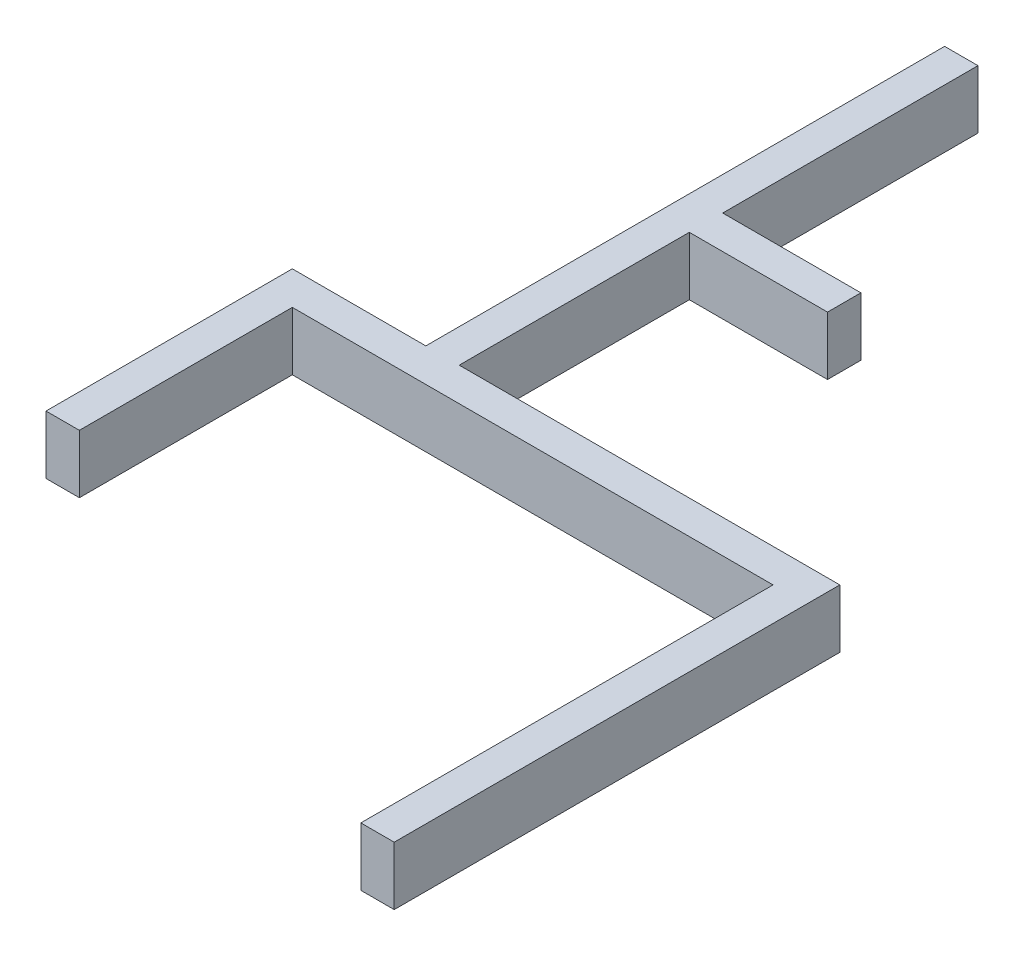
ISO-10303-21;
HEADER;
FILE_DESCRIPTION(('STEP AP214'),'2;1');
FILE_NAME('part.step','',(''),(''),'','','');
FILE_SCHEMA(('AUTOMOTIVE_DESIGN { 1 0 10303 214 1 1 1 1 }'));
ENDSEC;
DATA;
#1=APPLICATION_CONTEXT('core data for automotive mechanical design processes');
#2=APPLICATION_PROTOCOL_DEFINITION('international standard','automotive_design',2000,#1);
#3=PRODUCT_CONTEXT('',#1,'mechanical');
#4=PRODUCT('Part','Part','',(#3));
#5=PRODUCT_RELATED_PRODUCT_CATEGORY('part','',(#4));
#6=PRODUCT_DEFINITION_FORMATION('','',#4);
#7=PRODUCT_DEFINITION_CONTEXT('part definition',#1,'design');
#8=PRODUCT_DEFINITION('design','',#6,#7);
#9=PRODUCT_DEFINITION_SHAPE('','',#8);
#10=(LENGTH_UNIT() NAMED_UNIT(*) SI_UNIT(.MILLI.,.METRE.));
#11=(NAMED_UNIT(*) PLANE_ANGLE_UNIT() SI_UNIT($,.RADIAN.));
#12=(NAMED_UNIT(*) SI_UNIT($,.STERADIAN.) SOLID_ANGLE_UNIT());
#13=UNCERTAINTY_MEASURE_WITH_UNIT(LENGTH_MEASURE(1.E-05),#10,'distance_accuracy_value','');
#14=(GEOMETRIC_REPRESENTATION_CONTEXT(3) GLOBAL_UNCERTAINTY_ASSIGNED_CONTEXT((#13)) GLOBAL_UNIT_ASSIGNED_CONTEXT((#10,
#11,#12)) REPRESENTATION_CONTEXT('',''));
#15=CARTESIAN_POINT('',(0.,0.,0.));
#16=DIRECTION('',(0.,0.,1.));
#17=DIRECTION('',(1.,0.,0.));
#18=AXIS2_PLACEMENT_3D('',#15,#16,#17);
#19=CARTESIAN_POINT('',(0.,8.5,0.));
#20=DIRECTION('',(0.,1.,0.));
#21=DIRECTION('',(0.,0.,1.));
#22=AXIS2_PLACEMENT_3D('',#19,#20,#21);
#23=PLANE('',#22);
#24=DIRECTION('',(0.,0.,1.));
#25=VECTOR('',#24,1.);
#26=CARTESIAN_POINT('',(-73.4351958953211,8.5,23.5281866010738));
#27=LINE('',#26,#25);
#28=CARTESIAN_POINT('',(-73.4351958953211,8.5,23.5281866010738));
#29=VERTEX_POINT('',#28);
#30=CARTESIAN_POINT('',(-73.4351958953211,8.5,53.0424592907096));
#31=VERTEX_POINT('',#30);
#32=EDGE_CURVE('E215',#29,#31,#27,.T.);
#33=ORIENTED_EDGE('',*,*,#32,.T.);
#34=DIRECTION('',(1.,0.,0.));
#35=VECTOR('',#34,1.);
#36=CARTESIAN_POINT('',(-73.4351958953211,8.5,53.0424592907096));
#37=LINE('',#36,#35);
#38=CARTESIAN_POINT('',(-69.4351958953211,8.5,53.0424592907096));
#39=VERTEX_POINT('',#38);
#40=EDGE_CURVE('E167',#31,#39,#37,.T.);
#41=ORIENTED_EDGE('',*,*,#40,.T.);
#42=DIRECTION('',(0.,0.,-1.));
#43=VECTOR('',#42,1.);
#44=CARTESIAN_POINT('',(-69.4351958953211,8.5,53.0424592907096));
#45=LINE('',#44,#43);
#46=CARTESIAN_POINT('',(-69.4351958953211,8.5,27.5281866010738));
#47=VERTEX_POINT('',#46);
#48=EDGE_CURVE('E259',#39,#47,#45,.T.);
#49=ORIENTED_EDGE('',*,*,#48,.T.);
#50=DIRECTION('',(1.,0.,0.));
#51=VECTOR('',#50,1.);
#52=CARTESIAN_POINT('',(-69.4351958953211,8.5,27.5281866010738));
#53=LINE('',#52,#51);
#54=CARTESIAN_POINT('',(-11.8370887510235,8.5,27.5281866010738));
#55=VERTEX_POINT('',#54);
#56=EDGE_CURVE('E261',#47,#55,#53,.T.);
#57=ORIENTED_EDGE('',*,*,#56,.T.);
#58=DIRECTION('',(0.,0.,1.));
#59=VECTOR('',#58,1.);
#60=CARTESIAN_POINT('',(-11.8370887510235,8.5,27.5281866010738));
#61=LINE('',#60,#59);
#62=CARTESIAN_POINT('',(-11.8370887510235,8.5,76.9197025685448));
#63=VERTEX_POINT('',#62);
#64=EDGE_CURVE('E263',#55,#63,#61,.T.);
#65=ORIENTED_EDGE('',*,*,#64,.T.);
#66=DIRECTION('',(1.,0.,0.));
#67=VECTOR('',#66,1.);
#68=CARTESIAN_POINT('',(-11.8370887510235,8.5,76.9197025685448));
#69=LINE('',#68,#67);
#70=CARTESIAN_POINT('',(-7.83708875102354,8.5,76.9197025685448));
#71=VERTEX_POINT('',#70);
#72=EDGE_CURVE('E269',#63,#71,#69,.T.);
#73=ORIENTED_EDGE('',*,*,#72,.T.);
#74=DIRECTION('',(0.,0.,-1.));
#75=VECTOR('',#74,1.);
#76=CARTESIAN_POINT('',(-7.83708875102354,8.5,76.9197025685448));
#77=LINE('',#76,#75);
#78=CARTESIAN_POINT('',(-7.83708875102354,8.5,23.5281866010737));
#79=VERTEX_POINT('',#78);
#80=EDGE_CURVE('E271',#71,#79,#77,.T.);
#81=ORIENTED_EDGE('',*,*,#80,.T.);
#82=DIRECTION('',(-1.,0.,0.));
#83=VECTOR('',#82,1.);
#84=CARTESIAN_POINT('',(-7.83708875102354,8.5,23.5281866010737));
#85=LINE('',#84,#83);
#86=CARTESIAN_POINT('',(-53.4400509368989,8.5,23.5281866010738));
#87=VERTEX_POINT('',#86);
#88=EDGE_CURVE('E273',#79,#87,#85,.T.);
#89=ORIENTED_EDGE('',*,*,#88,.T.);
#90=DIRECTION('',(0.,0.,-1.));
#91=VECTOR('',#90,1.);
#92=CARTESIAN_POINT('',(-53.4400509368989,8.5,23.5281866010738));
#93=LINE('',#92,#91);
#94=CARTESIAN_POINT('',(-53.4400509368989,8.5,-4.04309491222454));
#95=VERTEX_POINT('',#94);
#96=EDGE_CURVE('E275',#87,#95,#93,.T.);
#97=ORIENTED_EDGE('',*,*,#96,.T.);
#98=DIRECTION('',(1.,0.,0.));
#99=VECTOR('',#98,1.);
#100=CARTESIAN_POINT('',(-53.4400509368989,8.5,-4.04309491222454));
#101=LINE('',#100,#99);
#102=CARTESIAN_POINT('',(-36.8826677432721,8.5,-4.04309491222454));
#103=VERTEX_POINT('',#102);
#104=EDGE_CURVE('E277',#95,#103,#101,.T.);
#105=ORIENTED_EDGE('',*,*,#104,.T.);
#106=DIRECTION('',(0.,0.,-1.));
#107=VECTOR('',#106,1.);
#108=CARTESIAN_POINT('',(-36.8826677432721,8.5,-4.04309491222454));
#109=LINE('',#108,#107);
#110=CARTESIAN_POINT('',(-36.8826677432721,8.5,-8.04309491222454));
#111=VERTEX_POINT('',#110);
#112=EDGE_CURVE('E279',#103,#111,#109,.T.);
#113=ORIENTED_EDGE('',*,*,#112,.T.);
#114=DIRECTION('',(-1.,0.,0.));
#115=VECTOR('',#114,1.);
#116=CARTESIAN_POINT('',(-36.8826677432721,8.5,-8.04309491222454));
#117=LINE('',#116,#115);
#118=CARTESIAN_POINT('',(-53.4400509368989,8.5,-8.04309491222454));
#119=VERTEX_POINT('',#118);
#120=EDGE_CURVE('E281',#111,#119,#117,.T.);
#121=ORIENTED_EDGE('',*,*,#120,.T.);
#122=DIRECTION('',(0.,0.,-1.));
#123=VECTOR('',#122,1.);
#124=CARTESIAN_POINT('',(-53.4400509368989,8.5,-8.04309491222454));
#125=LINE('',#124,#123);
#126=CARTESIAN_POINT('',(-53.4400509368989,8.5,-38.6311877701269));
#127=VERTEX_POINT('',#126);
#128=EDGE_CURVE('E283',#119,#127,#125,.T.);
#129=ORIENTED_EDGE('',*,*,#128,.T.);
#130=DIRECTION('',(-1.,0.,0.));
#131=VECTOR('',#130,1.);
#132=CARTESIAN_POINT('',(-53.4400509368989,8.5,-38.6311877701269));
#133=LINE('',#132,#131);
#134=CARTESIAN_POINT('',(-57.4400509368994,8.5,-38.6311877701269));
#135=VERTEX_POINT('',#134);
#136=EDGE_CURVE('E285',#127,#135,#133,.T.);
#137=ORIENTED_EDGE('',*,*,#136,.T.);
#138=DIRECTION('',(0.,0.,1.));
#139=VECTOR('',#138,1.);
#140=CARTESIAN_POINT('',(-57.4400509368994,8.5,-38.6311877701269));
#141=LINE('',#140,#139);
#142=CARTESIAN_POINT('',(-57.4400509368994,8.5,23.5281866010738));
#143=VERTEX_POINT('',#142);
#144=EDGE_CURVE('E286',#135,#143,#141,.T.);
#145=ORIENTED_EDGE('',*,*,#144,.T.);
#146=DIRECTION('',(-1.,0.,0.));
#147=VECTOR('',#146,1.);
#148=CARTESIAN_POINT('',(-57.4400509368994,8.5,23.5281866010738));
#149=LINE('',#148,#147);
#150=EDGE_CURVE('E61',#143,#29,#149,.T.);
#151=ORIENTED_EDGE('',*,*,#150,.T.);
#152=EDGE_LOOP('',(#33,#41,#49,#57,#65,#73,#81,#89,#97,#105,#113,#121,#129,#137,#145,#151));
#153=FACE_BOUND('',#152,.T.);
#154=ADVANCED_FACE('F45',(#153),#23,.T.);
#155=CARTESIAN_POINT('',(-69.4351958953211,8.5,53.0424592907096));
#156=DIRECTION('',(-1.,0.,0.));
#157=DIRECTION('',(0.,0.,1.));
#158=AXIS2_PLACEMENT_3D('',#155,#156,#157);
#159=PLANE('',#158);
#160=DIRECTION('',(0.,0.,-1.));
#161=VECTOR('',#160,1.);
#162=CARTESIAN_POINT('',(-69.4351958953211,1.5,53.0424592907096));
#163=LINE('',#162,#161);
#164=CARTESIAN_POINT('',(-69.4351958953211,1.5,53.0424592907096));
#165=VERTEX_POINT('',#164);
#166=CARTESIAN_POINT('',(-69.4351958953211,1.5,27.5281866010738));
#167=VERTEX_POINT('',#166);
#168=EDGE_CURVE('E160',#165,#167,#163,.T.);
#169=ORIENTED_EDGE('',*,*,#168,.T.);
#170=DIRECTION('',(0.,-1.,0.));
#171=VECTOR('',#170,1.);
#172=CARTESIAN_POINT('',(-69.4351958953211,8.5,27.5281866010738));
#173=LINE('',#172,#171);
#174=EDGE_CURVE('E253',#47,#167,#173,.T.);
#175=ORIENTED_EDGE('',*,*,#174,.F.);
#176=ORIENTED_EDGE('',*,*,#48,.F.);
#177=DIRECTION('',(0.,-1.,0.));
#178=VECTOR('',#177,1.);
#179=CARTESIAN_POINT('',(-69.4351958953211,8.5,53.0424592907096));
#180=LINE('',#179,#178);
#181=EDGE_CURVE('E54',#39,#165,#180,.T.);
#182=ORIENTED_EDGE('',*,*,#181,.T.);
#183=EDGE_LOOP('',(#169,#175,#176,#182));
#184=FACE_BOUND('',#183,.T.);
#185=ADVANCED_FACE('F257',(#184),#159,.F.);
#186=CARTESIAN_POINT('',(-69.4351958953211,8.5,27.5281866010738));
#187=DIRECTION('',(0.,0.,-1.));
#188=DIRECTION('',(-1.,0.,0.));
#189=AXIS2_PLACEMENT_3D('',#186,#187,#188);
#190=PLANE('',#189);
#191=DIRECTION('',(1.,0.,0.));
#192=VECTOR('',#191,1.);
#193=CARTESIAN_POINT('',(-69.4351958953211,1.5,27.5281866010738));
#194=LINE('',#193,#192);
#195=CARTESIAN_POINT('',(-11.8370887510235,1.5,27.5281866010738));
#196=VERTEX_POINT('',#195);
#197=EDGE_CURVE('E177',#167,#196,#194,.T.);
#198=ORIENTED_EDGE('',*,*,#197,.T.);
#199=DIRECTION('',(0.,-1.,0.));
#200=VECTOR('',#199,1.);
#201=CARTESIAN_POINT('',(-11.8370887510235,8.5,27.5281866010738));
#202=LINE('',#201,#200);
#203=EDGE_CURVE('E250',#55,#196,#202,.T.);
#204=ORIENTED_EDGE('',*,*,#203,.F.);
#205=ORIENTED_EDGE('',*,*,#56,.F.);
#206=ORIENTED_EDGE('',*,*,#174,.T.);
#207=EDGE_LOOP('',(#198,#204,#205,#206));
#208=FACE_BOUND('',#207,.T.);
#209=ADVANCED_FACE('F335',(#208),#190,.F.);
#210=CARTESIAN_POINT('',(-11.8370887510235,8.5,27.5281866010738));
#211=DIRECTION('',(1.,0.,0.));
#212=DIRECTION('',(0.,0.,-1.));
#213=AXIS2_PLACEMENT_3D('',#210,#211,#212);
#214=PLANE('',#213);
#215=DIRECTION('',(0.,0.,1.));
#216=VECTOR('',#215,1.);
#217=CARTESIAN_POINT('',(-11.8370887510235,1.5,27.5281866010738));
#218=LINE('',#217,#216);
#219=CARTESIAN_POINT('',(-11.8370887510235,1.5,76.9197025685448));
#220=VERTEX_POINT('',#219);
#221=EDGE_CURVE('E180',#196,#220,#218,.T.);
#222=ORIENTED_EDGE('',*,*,#221,.T.);
#223=DIRECTION('',(0.,-1.,0.));
#224=VECTOR('',#223,1.);
#225=CARTESIAN_POINT('',(-11.8370887510235,8.5,76.9197025685448));
#226=LINE('',#225,#224);
#227=EDGE_CURVE('E247',#63,#220,#226,.T.);
#228=ORIENTED_EDGE('',*,*,#227,.F.);
#229=ORIENTED_EDGE('',*,*,#64,.F.);
#230=ORIENTED_EDGE('',*,*,#203,.T.);
#231=EDGE_LOOP('',(#222,#228,#229,#230));
#232=FACE_BOUND('',#231,.T.);
#233=ADVANCED_FACE('F332',(#232),#214,.F.);
#234=CARTESIAN_POINT('',(-11.8370887510235,8.5,76.9197025685448));
#235=DIRECTION('',(0.,0.,-1.));
#236=DIRECTION('',(-1.,0.,0.));
#237=AXIS2_PLACEMENT_3D('',#234,#235,#236);
#238=PLANE('',#237);
#239=DIRECTION('',(1.,0.,0.));
#240=VECTOR('',#239,1.);
#241=CARTESIAN_POINT('',(-11.8370887510235,1.5,76.9197025685448));
#242=LINE('',#241,#240);
#243=CARTESIAN_POINT('',(-7.83708875102354,1.5,76.9197025685448));
#244=VERTEX_POINT('',#243);
#245=EDGE_CURVE('E183',#220,#244,#242,.T.);
#246=ORIENTED_EDGE('',*,*,#245,.T.);
#247=DIRECTION('',(0.,-1.,0.));
#248=VECTOR('',#247,1.);
#249=CARTESIAN_POINT('',(-7.83708875102354,8.5,76.9197025685448));
#250=LINE('',#249,#248);
#251=EDGE_CURVE('E244',#71,#244,#250,.T.);
#252=ORIENTED_EDGE('',*,*,#251,.F.);
#253=ORIENTED_EDGE('',*,*,#72,.F.);
#254=ORIENTED_EDGE('',*,*,#227,.T.);
#255=EDGE_LOOP('',(#246,#252,#253,#254));
#256=FACE_BOUND('',#255,.T.);
#257=ADVANCED_FACE('F327',(#256),#238,.F.);
#258=CARTESIAN_POINT('',(-7.83708875102354,8.5,76.9197025685448));
#259=DIRECTION('',(-1.,0.,0.));
#260=DIRECTION('',(0.,0.,1.));
#261=AXIS2_PLACEMENT_3D('',#258,#259,#260);
#262=PLANE('',#261);
#263=DIRECTION('',(0.,0.,-1.));
#264=VECTOR('',#263,1.);
#265=CARTESIAN_POINT('',(-7.83708875102354,1.5,76.9197025685448));
#266=LINE('',#265,#264);
#267=CARTESIAN_POINT('',(-7.83708875102354,1.5,23.5281866010737));
#268=VERTEX_POINT('',#267);
#269=EDGE_CURVE('E186',#244,#268,#266,.T.);
#270=ORIENTED_EDGE('',*,*,#269,.T.);
#271=DIRECTION('',(0.,-1.,0.));
#272=VECTOR('',#271,1.);
#273=CARTESIAN_POINT('',(-7.83708875102354,8.5,23.5281866010737));
#274=LINE('',#273,#272);
#275=EDGE_CURVE('E241',#79,#268,#274,.T.);
#276=ORIENTED_EDGE('',*,*,#275,.F.);
#277=ORIENTED_EDGE('',*,*,#80,.F.);
#278=ORIENTED_EDGE('',*,*,#251,.T.);
#279=EDGE_LOOP('',(#270,#276,#277,#278));
#280=FACE_BOUND('',#279,.T.);
#281=ADVANCED_FACE('F324',(#280),#262,.F.);
#282=CARTESIAN_POINT('',(-7.83708875102354,8.5,23.5281866010737));
#283=DIRECTION('',(0.,0.,1.));
#284=DIRECTION('',(1.,0.,0.));
#285=AXIS2_PLACEMENT_3D('',#282,#283,#284);
#286=PLANE('',#285);
#287=DIRECTION('',(-1.,0.,0.));
#288=VECTOR('',#287,1.);
#289=CARTESIAN_POINT('',(-7.83708875102354,1.5,23.5281866010737));
#290=LINE('',#289,#288);
#291=CARTESIAN_POINT('',(-53.4400509368989,1.5,23.5281866010738));
#292=VERTEX_POINT('',#291);
#293=EDGE_CURVE('E189',#268,#292,#290,.T.);
#294=ORIENTED_EDGE('',*,*,#293,.T.);
#295=DIRECTION('',(0.,-1.,0.));
#296=VECTOR('',#295,1.);
#297=CARTESIAN_POINT('',(-53.4400509368989,8.5,23.5281866010738));
#298=LINE('',#297,#296);
#299=EDGE_CURVE('E238',#87,#292,#298,.T.);
#300=ORIENTED_EDGE('',*,*,#299,.F.);
#301=ORIENTED_EDGE('',*,*,#88,.F.);
#302=ORIENTED_EDGE('',*,*,#275,.T.);
#303=EDGE_LOOP('',(#294,#300,#301,#302));
#304=FACE_BOUND('',#303,.T.);
#305=ADVANCED_FACE('F319',(#304),#286,.F.);
#306=CARTESIAN_POINT('',(-53.4400509368989,8.5,23.5281866010738));
#307=DIRECTION('',(-1.,0.,0.));
#308=DIRECTION('',(0.,0.,1.));
#309=AXIS2_PLACEMENT_3D('',#306,#307,#308);
#310=PLANE('',#309);
#311=DIRECTION('',(0.,0.,-1.));
#312=VECTOR('',#311,1.);
#313=CARTESIAN_POINT('',(-53.4400509368989,1.5,23.5281866010738));
#314=LINE('',#313,#312);
#315=CARTESIAN_POINT('',(-53.4400509368989,1.5,-4.04309491222454));
#316=VERTEX_POINT('',#315);
#317=EDGE_CURVE('E192',#292,#316,#314,.T.);
#318=ORIENTED_EDGE('',*,*,#317,.T.);
#319=DIRECTION('',(0.,-1.,0.));
#320=VECTOR('',#319,1.);
#321=CARTESIAN_POINT('',(-53.4400509368989,8.5,-4.04309491222454));
#322=LINE('',#321,#320);
#323=EDGE_CURVE('E235',#95,#316,#322,.T.);
#324=ORIENTED_EDGE('',*,*,#323,.F.);
#325=ORIENTED_EDGE('',*,*,#96,.F.);
#326=ORIENTED_EDGE('',*,*,#299,.T.);
#327=EDGE_LOOP('',(#318,#324,#325,#326));
#328=FACE_BOUND('',#327,.T.);
#329=ADVANCED_FACE('F316',(#328),#310,.F.);
#330=CARTESIAN_POINT('',(-53.4400509368989,8.5,-4.04309491222454));
#331=DIRECTION('',(0.,0.,-1.));
#332=DIRECTION('',(-1.,0.,0.));
#333=AXIS2_PLACEMENT_3D('',#330,#331,#332);
#334=PLANE('',#333);
#335=DIRECTION('',(1.,0.,0.));
#336=VECTOR('',#335,1.);
#337=CARTESIAN_POINT('',(-53.4400509368989,1.5,-4.04309491222454));
#338=LINE('',#337,#336);
#339=CARTESIAN_POINT('',(-36.8826677432721,1.5,-4.04309491222454));
#340=VERTEX_POINT('',#339);
#341=EDGE_CURVE('E195',#316,#340,#338,.T.);
#342=ORIENTED_EDGE('',*,*,#341,.T.);
#343=DIRECTION('',(0.,-1.,0.));
#344=VECTOR('',#343,1.);
#345=CARTESIAN_POINT('',(-36.8826677432721,8.5,-4.04309491222454));
#346=LINE('',#345,#344);
#347=EDGE_CURVE('E232',#103,#340,#346,.T.);
#348=ORIENTED_EDGE('',*,*,#347,.F.);
#349=ORIENTED_EDGE('',*,*,#104,.F.);
#350=ORIENTED_EDGE('',*,*,#323,.T.);
#351=EDGE_LOOP('',(#342,#348,#349,#350));
#352=FACE_BOUND('',#351,.T.);
#353=ADVANCED_FACE('F311',(#352),#334,.F.);
#354=CARTESIAN_POINT('',(-36.8826677432721,8.5,-4.04309491222454));
#355=DIRECTION('',(-1.,0.,0.));
#356=DIRECTION('',(0.,0.,1.));
#357=AXIS2_PLACEMENT_3D('',#354,#355,#356);
#358=PLANE('',#357);
#359=DIRECTION('',(0.,0.,-1.));
#360=VECTOR('',#359,1.);
#361=CARTESIAN_POINT('',(-36.8826677432721,1.5,-4.04309491222454));
#362=LINE('',#361,#360);
#363=CARTESIAN_POINT('',(-36.8826677432721,1.5,-8.04309491222454));
#364=VERTEX_POINT('',#363);
#365=EDGE_CURVE('E198',#340,#364,#362,.T.);
#366=ORIENTED_EDGE('',*,*,#365,.T.);
#367=DIRECTION('',(0.,-1.,0.));
#368=VECTOR('',#367,1.);
#369=CARTESIAN_POINT('',(-36.8826677432721,8.5,-8.04309491222454));
#370=LINE('',#369,#368);
#371=EDGE_CURVE('E229',#111,#364,#370,.T.);
#372=ORIENTED_EDGE('',*,*,#371,.F.);
#373=ORIENTED_EDGE('',*,*,#112,.F.);
#374=ORIENTED_EDGE('',*,*,#347,.T.);
#375=EDGE_LOOP('',(#366,#372,#373,#374));
#376=FACE_BOUND('',#375,.T.);
#377=ADVANCED_FACE('F308',(#376),#358,.F.);
#378=CARTESIAN_POINT('',(-36.8826677432721,8.5,-8.04309491222454));
#379=DIRECTION('',(0.,0.,1.));
#380=DIRECTION('',(1.,0.,0.));
#381=AXIS2_PLACEMENT_3D('',#378,#379,#380);
#382=PLANE('',#381);
#383=DIRECTION('',(-1.,0.,0.));
#384=VECTOR('',#383,1.);
#385=CARTESIAN_POINT('',(-36.8826677432721,1.5,-8.04309491222454));
#386=LINE('',#385,#384);
#387=CARTESIAN_POINT('',(-53.4400509368989,1.5,-8.04309491222454));
#388=VERTEX_POINT('',#387);
#389=EDGE_CURVE('E201',#364,#388,#386,.T.);
#390=ORIENTED_EDGE('',*,*,#389,.T.);
#391=DIRECTION('',(0.,-1.,0.));
#392=VECTOR('',#391,1.);
#393=CARTESIAN_POINT('',(-53.4400509368989,8.5,-8.04309491222454));
#394=LINE('',#393,#392);
#395=EDGE_CURVE('E226',#119,#388,#394,.T.);
#396=ORIENTED_EDGE('',*,*,#395,.F.);
#397=ORIENTED_EDGE('',*,*,#120,.F.);
#398=ORIENTED_EDGE('',*,*,#371,.T.);
#399=EDGE_LOOP('',(#390,#396,#397,#398));
#400=FACE_BOUND('',#399,.T.);
#401=ADVANCED_FACE('F303',(#400),#382,.F.);
#402=CARTESIAN_POINT('',(-53.4400509368989,8.5,-8.04309491222454));
#403=DIRECTION('',(-1.,0.,0.));
#404=DIRECTION('',(0.,0.,1.));
#405=AXIS2_PLACEMENT_3D('',#402,#403,#404);
#406=PLANE('',#405);
#407=DIRECTION('',(0.,0.,-1.));
#408=VECTOR('',#407,1.);
#409=CARTESIAN_POINT('',(-53.4400509368989,1.5,-8.04309491222454));
#410=LINE('',#409,#408);
#411=CARTESIAN_POINT('',(-53.4400509368989,1.5,-38.6311877701269));
#412=VERTEX_POINT('',#411);
#413=EDGE_CURVE('E204',#388,#412,#410,.T.);
#414=ORIENTED_EDGE('',*,*,#413,.T.);
#415=DIRECTION('',(0.,-1.,0.));
#416=VECTOR('',#415,1.);
#417=CARTESIAN_POINT('',(-53.4400509368989,8.5,-38.6311877701269));
#418=LINE('',#417,#416);
#419=EDGE_CURVE('E223',#127,#412,#418,.T.);
#420=ORIENTED_EDGE('',*,*,#419,.F.);
#421=ORIENTED_EDGE('',*,*,#128,.F.);
#422=ORIENTED_EDGE('',*,*,#395,.T.);
#423=EDGE_LOOP('',(#414,#420,#421,#422));
#424=FACE_BOUND('',#423,.T.);
#425=ADVANCED_FACE('F300',(#424),#406,.F.);
#426=CARTESIAN_POINT('',(-53.4400509368989,8.5,-38.6311877701269));
#427=DIRECTION('',(0.,0.,1.));
#428=DIRECTION('',(1.,0.,0.));
#429=AXIS2_PLACEMENT_3D('',#426,#427,#428);
#430=PLANE('',#429);
#431=DIRECTION('',(-1.,0.,0.));
#432=VECTOR('',#431,1.);
#433=CARTESIAN_POINT('',(-53.4400509368989,1.5,-38.6311877701269));
#434=LINE('',#433,#432);
#435=CARTESIAN_POINT('',(-57.4400509368994,1.5,-38.6311877701269));
#436=VERTEX_POINT('',#435);
#437=EDGE_CURVE('E207',#412,#436,#434,.T.);
#438=ORIENTED_EDGE('',*,*,#437,.T.);
#439=DIRECTION('',(0.,-1.,0.));
#440=VECTOR('',#439,1.);
#441=CARTESIAN_POINT('',(-57.4400509368994,8.5,-38.6311877701269));
#442=LINE('',#441,#440);
#443=EDGE_CURVE('E220',#135,#436,#442,.T.);
#444=ORIENTED_EDGE('',*,*,#443,.F.);
#445=ORIENTED_EDGE('',*,*,#136,.F.);
#446=ORIENTED_EDGE('',*,*,#419,.T.);
#447=EDGE_LOOP('',(#438,#444,#445,#446));
#448=FACE_BOUND('',#447,.T.);
#449=ADVANCED_FACE('F296',(#448),#430,.F.);
#450=CARTESIAN_POINT('',(-57.4400509368994,8.5,-38.6311877701269));
#451=DIRECTION('',(1.,0.,0.));
#452=DIRECTION('',(0.,0.,-1.));
#453=AXIS2_PLACEMENT_3D('',#450,#451,#452);
#454=PLANE('',#453);
#455=DIRECTION('',(0.,0.,1.));
#456=VECTOR('',#455,1.);
#457=CARTESIAN_POINT('',(-57.4400509368994,1.5,-38.6311877701269));
#458=LINE('',#457,#456);
#459=CARTESIAN_POINT('',(-57.4400509368994,1.5,23.5281866010738));
#460=VERTEX_POINT('',#459);
#461=EDGE_CURVE('E210',#436,#460,#458,.T.);
#462=ORIENTED_EDGE('',*,*,#461,.T.);
#463=DIRECTION('',(0.,-1.,0.));
#464=VECTOR('',#463,1.);
#465=CARTESIAN_POINT('',(-57.4400509368994,8.5,23.5281866010738));
#466=LINE('',#465,#464);
#467=EDGE_CURVE('E217',#143,#460,#466,.T.);
#468=ORIENTED_EDGE('',*,*,#467,.F.);
#469=ORIENTED_EDGE('',*,*,#144,.F.);
#470=ORIENTED_EDGE('',*,*,#443,.T.);
#471=EDGE_LOOP('',(#462,#468,#469,#470));
#472=FACE_BOUND('',#471,.T.);
#473=ADVANCED_FACE('F292',(#472),#454,.F.);
#474=CARTESIAN_POINT('',(-57.4400509368994,8.5,23.5281866010738));
#475=DIRECTION('',(0.,0.,1.));
#476=DIRECTION('',(1.,0.,0.));
#477=AXIS2_PLACEMENT_3D('',#474,#475,#476);
#478=PLANE('',#477);
#479=DIRECTION('',(-1.,0.,0.));
#480=VECTOR('',#479,1.);
#481=CARTESIAN_POINT('',(-57.4400509368994,1.5,23.5281866010738));
#482=LINE('',#481,#480);
#483=CARTESIAN_POINT('',(-73.4351958953211,1.5,23.5281866010738));
#484=VERTEX_POINT('',#483);
#485=EDGE_CURVE('E213',#460,#484,#482,.T.);
#486=ORIENTED_EDGE('',*,*,#485,.T.);
#487=DIRECTION('',(0.,-1.,0.));
#488=VECTOR('',#487,1.);
#489=CARTESIAN_POINT('',(-73.4351958953211,8.5,23.5281866010738));
#490=LINE('',#489,#488);
#491=EDGE_CURVE('E171',#29,#484,#490,.T.);
#492=ORIENTED_EDGE('',*,*,#491,.F.);
#493=ORIENTED_EDGE('',*,*,#150,.F.);
#494=ORIENTED_EDGE('',*,*,#467,.T.);
#495=EDGE_LOOP('',(#486,#492,#493,#494));
#496=FACE_BOUND('',#495,.T.);
#497=ADVANCED_FACE('F294',(#496),#478,.F.);
#498=CARTESIAN_POINT('',(-73.4351958953211,8.5,23.5281866010738));
#499=DIRECTION('',(1.,0.,0.));
#500=DIRECTION('',(0.,0.,-1.));
#501=AXIS2_PLACEMENT_3D('',#498,#499,#500);
#502=PLANE('',#501);
#503=DIRECTION('',(0.,0.,1.));
#504=VECTOR('',#503,1.);
#505=CARTESIAN_POINT('',(-73.4351958953211,1.5,23.5281866010738));
#506=LINE('',#505,#504);
#507=CARTESIAN_POINT('',(-73.4351958953211,1.5,53.0424592907096));
#508=VERTEX_POINT('',#507);
#509=EDGE_CURVE('E157',#484,#508,#506,.T.);
#510=ORIENTED_EDGE('',*,*,#509,.T.);
#511=DIRECTION('',(0.,-1.,0.));
#512=VECTOR('',#511,1.);
#513=CARTESIAN_POINT('',(-73.4351958953211,8.5,53.0424592907096));
#514=LINE('',#513,#512);
#515=EDGE_CURVE('E11',#31,#508,#514,.T.);
#516=ORIENTED_EDGE('',*,*,#515,.F.);
#517=ORIENTED_EDGE('',*,*,#32,.F.);
#518=ORIENTED_EDGE('',*,*,#491,.T.);
#519=EDGE_LOOP('',(#510,#516,#517,#518));
#520=FACE_BOUND('',#519,.T.);
#521=ADVANCED_FACE('F47',(#520),#502,.F.);
#522=CARTESIAN_POINT('',(-73.4351958953211,8.5,53.0424592907096));
#523=DIRECTION('',(0.,0.,-1.));
#524=DIRECTION('',(-1.,0.,0.));
#525=AXIS2_PLACEMENT_3D('',#522,#523,#524);
#526=PLANE('',#525);
#527=DIRECTION('',(1.,0.,0.));
#528=VECTOR('',#527,1.);
#529=CARTESIAN_POINT('',(-73.4351958953211,1.5,53.0424592907096));
#530=LINE('',#529,#528);
#531=EDGE_CURVE('E154',#508,#165,#530,.T.);
#532=ORIENTED_EDGE('',*,*,#531,.T.);
#533=ORIENTED_EDGE('',*,*,#181,.F.);
#534=ORIENTED_EDGE('',*,*,#40,.F.);
#535=ORIENTED_EDGE('',*,*,#515,.T.);
#536=EDGE_LOOP('',(#532,#533,#534,#535));
#537=FACE_BOUND('',#536,.T.);
#538=ADVANCED_FACE('F166',(#537),#526,.F.);
#539=CARTESIAN_POINT('',(-74.1819559113916,1.5,-47.8144829176489));
#540=DIRECTION('',(0.,1.,0.));
#541=DIRECTION('',(0.,0.,1.));
#542=AXIS2_PLACEMENT_3D('',#539,#540,#541);
#543=PLANE('',#542);
#544=ORIENTED_EDGE('',*,*,#531,.F.);
#545=ORIENTED_EDGE('',*,*,#509,.F.);
#546=ORIENTED_EDGE('',*,*,#485,.F.);
#547=ORIENTED_EDGE('',*,*,#461,.F.);
#548=ORIENTED_EDGE('',*,*,#437,.F.);
#549=ORIENTED_EDGE('',*,*,#413,.F.);
#550=ORIENTED_EDGE('',*,*,#389,.F.);
#551=ORIENTED_EDGE('',*,*,#365,.F.);
#552=ORIENTED_EDGE('',*,*,#341,.F.);
#553=ORIENTED_EDGE('',*,*,#317,.F.);
#554=ORIENTED_EDGE('',*,*,#293,.F.);
#555=ORIENTED_EDGE('',*,*,#269,.F.);
#556=ORIENTED_EDGE('',*,*,#245,.F.);
#557=ORIENTED_EDGE('',*,*,#221,.F.);
#558=ORIENTED_EDGE('',*,*,#197,.F.);
#559=ORIENTED_EDGE('',*,*,#168,.F.);
#560=EDGE_LOOP('',(#544,#545,#546,#547,#548,#549,#550,#551,#552,#553,#554,#555,#556,#557,#558,#559));
#561=FACE_BOUND('',#560,.T.);
#562=ADVANCED_FACE('F155',(#561),#543,.F.);
#563=CLOSED_SHELL('',(#154,#185,#209,#233,#257,#281,#305,#329,#353,#377,#401,#425,#449,#473,
#497,#521,#538,#562));
#564=MANIFOLD_SOLID_BREP('B2',#563);
#565=ADVANCED_BREP_SHAPE_REPRESENTATION('',(#18,#564),#14);
#566=SHAPE_DEFINITION_REPRESENTATION(#9,#565);
ENDSEC;
END-ISO-10303-21;
